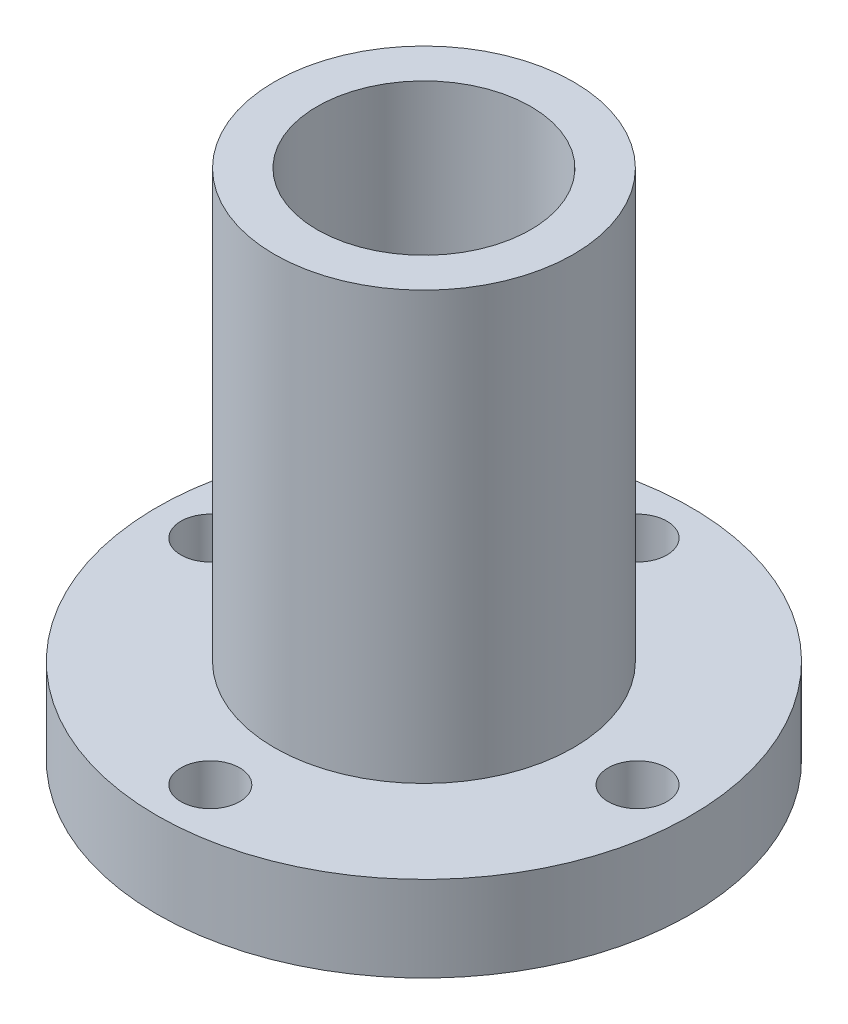
ISO-10303-21;
HEADER;
FILE_DESCRIPTION(('STEP AP214'),'2;1');
FILE_NAME('part.step','',(''),(''),'','','');
FILE_SCHEMA(('AUTOMOTIVE_DESIGN { 1 0 10303 214 1 1 1 1 }'));
ENDSEC;
DATA;
#1=APPLICATION_CONTEXT('core data for automotive mechanical design processes');
#2=APPLICATION_PROTOCOL_DEFINITION('international standard','automotive_design',2000,#1);
#3=PRODUCT_CONTEXT('',#1,'mechanical');
#4=PRODUCT('Part','Part','',(#3));
#5=PRODUCT_RELATED_PRODUCT_CATEGORY('part','',(#4));
#6=PRODUCT_DEFINITION_FORMATION('','',#4);
#7=PRODUCT_DEFINITION_CONTEXT('part definition',#1,'design');
#8=PRODUCT_DEFINITION('design','',#6,#7);
#9=PRODUCT_DEFINITION_SHAPE('','',#8);
#10=(LENGTH_UNIT() NAMED_UNIT(*) SI_UNIT(.MILLI.,.METRE.));
#11=(NAMED_UNIT(*) PLANE_ANGLE_UNIT() SI_UNIT($,.RADIAN.));
#12=(NAMED_UNIT(*) SI_UNIT($,.STERADIAN.) SOLID_ANGLE_UNIT());
#13=UNCERTAINTY_MEASURE_WITH_UNIT(LENGTH_MEASURE(1.E-05),#10,'distance_accuracy_value','');
#14=(GEOMETRIC_REPRESENTATION_CONTEXT(3) GLOBAL_UNCERTAINTY_ASSIGNED_CONTEXT((#13)) GLOBAL_UNIT_ASSIGNED_CONTEXT((#10,
#11,#12)) REPRESENTATION_CONTEXT('',''));
#15=CARTESIAN_POINT('',(0.,0.,0.));
#16=DIRECTION('',(0.,0.,1.));
#17=DIRECTION('',(1.,0.,0.));
#18=AXIS2_PLACEMENT_3D('',#15,#16,#17);
#19=CARTESIAN_POINT('',(0.,8.,0.));
#20=DIRECTION('',(0.,-1.,0.));
#21=DIRECTION('',(0.,0.,-1.));
#22=AXIS2_PLACEMENT_3D('',#19,#20,#21);
#23=CYLINDRICAL_SURFACE('',#22,25.);
#24=CARTESIAN_POINT('',(0.,8.,0.));
#25=DIRECTION('',(0.,1.,0.));
#26=DIRECTION('',(0.,0.,1.));
#27=AXIS2_PLACEMENT_3D('',#24,#25,#26);
#28=CIRCLE('',#27,25.);
#29=CARTESIAN_POINT('',(0.,8.,25.));
#30=VERTEX_POINT('',#29);
#31=EDGE_CURVE('E42',#30,#30,#28,.T.);
#32=ORIENTED_EDGE('',*,*,#31,.F.);
#33=EDGE_LOOP('',(#32));
#34=FACE_BOUND('',#33,.T.);
#35=CARTESIAN_POINT('',(0.,0.,0.));
#36=DIRECTION('',(0.,1.,0.));
#37=DIRECTION('',(0.,0.,1.));
#38=AXIS2_PLACEMENT_3D('',#35,#36,#37);
#39=CIRCLE('',#38,25.);
#40=CARTESIAN_POINT('',(0.,0.,25.));
#41=VERTEX_POINT('',#40);
#42=EDGE_CURVE('E47',#41,#41,#39,.T.);
#43=ORIENTED_EDGE('',*,*,#42,.T.);
#44=EDGE_LOOP('',(#43));
#45=FACE_BOUND('',#44,.T.);
#46=ADVANCED_FACE('F35',(#34,#45),#23,.T.);
#47=CARTESIAN_POINT('',(0.,8.,0.));
#48=DIRECTION('',(0.,1.,0.));
#49=DIRECTION('',(0.,0.,1.));
#50=AXIS2_PLACEMENT_3D('',#47,#48,#49);
#51=PLANE('',#50);
#52=CARTESIAN_POINT('',(0.,8.,-20.));
#53=DIRECTION('',(0.,1.,0.));
#54=DIRECTION('',(0.,0.,1.));
#55=AXIS2_PLACEMENT_3D('',#52,#53,#54);
#56=CIRCLE('',#55,2.75);
#57=CARTESIAN_POINT('',(0.,8.,-17.25));
#58=VERTEX_POINT('',#57);
#59=EDGE_CURVE('E63',#58,#58,#56,.T.);
#60=ORIENTED_EDGE('',*,*,#59,.F.);
#61=EDGE_LOOP('',(#60));
#62=FACE_BOUND('',#61,.T.);
#63=CARTESIAN_POINT('',(20.,8.,0.));
#64=DIRECTION('',(0.,1.,0.));
#65=DIRECTION('',(0.,0.,1.));
#66=AXIS2_PLACEMENT_3D('',#63,#64,#65);
#67=CIRCLE('',#66,2.75);
#68=CARTESIAN_POINT('',(20.,8.,2.75));
#69=VERTEX_POINT('',#68);
#70=EDGE_CURVE('E67',#69,#69,#67,.T.);
#71=ORIENTED_EDGE('',*,*,#70,.F.);
#72=EDGE_LOOP('',(#71));
#73=FACE_BOUND('',#72,.T.);
#74=CARTESIAN_POINT('',(0.,8.,20.));
#75=DIRECTION('',(0.,1.,0.));
#76=DIRECTION('',(0.,0.,1.));
#77=AXIS2_PLACEMENT_3D('',#74,#75,#76);
#78=CIRCLE('',#77,2.75);
#79=CARTESIAN_POINT('',(0.,8.,22.75));
#80=VERTEX_POINT('',#79);
#81=EDGE_CURVE('E72',#80,#80,#78,.T.);
#82=ORIENTED_EDGE('',*,*,#81,.F.);
#83=EDGE_LOOP('',(#82));
#84=FACE_BOUND('',#83,.T.);
#85=CARTESIAN_POINT('',(-20.,8.,0.));
#86=DIRECTION('',(0.,1.,0.));
#87=DIRECTION('',(0.,0.,1.));
#88=AXIS2_PLACEMENT_3D('',#85,#86,#87);
#89=CIRCLE('',#88,2.75);
#90=CARTESIAN_POINT('',(-20.,8.,2.75));
#91=VERTEX_POINT('',#90);
#92=EDGE_CURVE('E75',#91,#91,#89,.T.);
#93=ORIENTED_EDGE('',*,*,#92,.F.);
#94=EDGE_LOOP('',(#93));
#95=FACE_BOUND('',#94,.T.);
#96=CARTESIAN_POINT('',(0.,8.,0.));
#97=DIRECTION('',(0.,1.,0.));
#98=DIRECTION('',(0.,0.,1.));
#99=AXIS2_PLACEMENT_3D('',#96,#97,#98);
#100=CIRCLE('',#99,14.);
#101=CARTESIAN_POINT('',(0.,8.,14.));
#102=VERTEX_POINT('',#101);
#103=EDGE_CURVE('E10',#102,#102,#100,.T.);
#104=ORIENTED_EDGE('',*,*,#103,.F.);
#105=EDGE_LOOP('',(#104));
#106=FACE_BOUND('',#105,.T.);
#107=ORIENTED_EDGE('',*,*,#31,.T.);
#108=EDGE_LOOP('',(#107));
#109=FACE_BOUND('',#108,.T.);
#110=ADVANCED_FACE('F106',(#62,#73,#84,#95,#106,#109),#51,.T.);
#111=CARTESIAN_POINT('',(0.,0.,0.));
#112=DIRECTION('',(0.,1.,0.));
#113=DIRECTION('',(0.,0.,1.));
#114=AXIS2_PLACEMENT_3D('',#111,#112,#113);
#115=PLANE('',#114);
#116=CARTESIAN_POINT('',(0.,0.,-20.));
#117=DIRECTION('',(0.,1.,0.));
#118=DIRECTION('',(0.,0.,1.));
#119=AXIS2_PLACEMENT_3D('',#116,#117,#118);
#120=CIRCLE('',#119,2.75);
#121=CARTESIAN_POINT('',(0.,0.,-17.25));
#122=VERTEX_POINT('',#121);
#123=EDGE_CURVE('E78',#122,#122,#120,.T.);
#124=ORIENTED_EDGE('',*,*,#123,.T.);
#125=EDGE_LOOP('',(#124));
#126=FACE_BOUND('',#125,.T.);
#127=CARTESIAN_POINT('',(20.,0.,0.));
#128=DIRECTION('',(0.,1.,0.));
#129=DIRECTION('',(0.,0.,1.));
#130=AXIS2_PLACEMENT_3D('',#127,#128,#129);
#131=CIRCLE('',#130,2.75);
#132=CARTESIAN_POINT('',(20.,0.,2.75));
#133=VERTEX_POINT('',#132);
#134=EDGE_CURVE('E85',#133,#133,#131,.T.);
#135=ORIENTED_EDGE('',*,*,#134,.T.);
#136=EDGE_LOOP('',(#135));
#137=FACE_BOUND('',#136,.T.);
#138=CARTESIAN_POINT('',(0.,0.,20.));
#139=DIRECTION('',(0.,1.,0.));
#140=DIRECTION('',(0.,0.,1.));
#141=AXIS2_PLACEMENT_3D('',#138,#139,#140);
#142=CIRCLE('',#141,2.75);
#143=CARTESIAN_POINT('',(0.,0.,22.75));
#144=VERTEX_POINT('',#143);
#145=EDGE_CURVE('E82',#144,#144,#142,.T.);
#146=ORIENTED_EDGE('',*,*,#145,.T.);
#147=EDGE_LOOP('',(#146));
#148=FACE_BOUND('',#147,.T.);
#149=CARTESIAN_POINT('',(-20.,0.,0.));
#150=DIRECTION('',(0.,1.,0.));
#151=DIRECTION('',(0.,0.,1.));
#152=AXIS2_PLACEMENT_3D('',#149,#150,#151);
#153=CIRCLE('',#152,2.75);
#154=CARTESIAN_POINT('',(-20.,0.,2.75));
#155=VERTEX_POINT('',#154);
#156=EDGE_CURVE('E79',#155,#155,#153,.T.);
#157=ORIENTED_EDGE('',*,*,#156,.T.);
#158=EDGE_LOOP('',(#157));
#159=FACE_BOUND('',#158,.T.);
#160=CARTESIAN_POINT('',(0.,0.,0.));
#161=DIRECTION('',(0.,1.,0.));
#162=DIRECTION('',(0.,0.,1.));
#163=AXIS2_PLACEMENT_3D('',#160,#161,#162);
#164=CIRCLE('',#163,10.);
#165=CARTESIAN_POINT('',(0.,0.,10.));
#166=VERTEX_POINT('',#165);
#167=EDGE_CURVE('E59',#166,#166,#164,.T.);
#168=ORIENTED_EDGE('',*,*,#167,.T.);
#169=EDGE_LOOP('',(#168));
#170=FACE_BOUND('',#169,.T.);
#171=ORIENTED_EDGE('',*,*,#42,.F.);
#172=EDGE_LOOP('',(#171));
#173=FACE_BOUND('',#172,.T.);
#174=ADVANCED_FACE('F91',(#126,#137,#148,#159,#170,#173),#115,.F.);
#175=CARTESIAN_POINT('',(0.,48.,0.));
#176=DIRECTION('',(0.,-1.,0.));
#177=DIRECTION('',(0.,0.,-1.));
#178=AXIS2_PLACEMENT_3D('',#175,#176,#177);
#179=CYLINDRICAL_SURFACE('',#178,14.);
#180=CARTESIAN_POINT('',(0.,48.,0.));
#181=DIRECTION('',(0.,1.,0.));
#182=DIRECTION('',(0.,0.,1.));
#183=AXIS2_PLACEMENT_3D('',#180,#181,#182);
#184=CIRCLE('',#183,14.);
#185=CARTESIAN_POINT('',(0.,48.,14.));
#186=VERTEX_POINT('',#185);
#187=EDGE_CURVE('E50',#186,#186,#184,.T.);
#188=ORIENTED_EDGE('',*,*,#187,.F.);
#189=EDGE_LOOP('',(#188));
#190=FACE_BOUND('',#189,.T.);
#191=ORIENTED_EDGE('',*,*,#103,.T.);
#192=EDGE_LOOP('',(#191));
#193=FACE_BOUND('',#192,.T.);
#194=ADVANCED_FACE('F118',(#190,#193),#179,.T.);
#195=CARTESIAN_POINT('',(0.,48.,0.));
#196=DIRECTION('',(0.,1.,0.));
#197=DIRECTION('',(0.,0.,1.));
#198=AXIS2_PLACEMENT_3D('',#195,#196,#197);
#199=PLANE('',#198);
#200=CARTESIAN_POINT('',(0.,48.,0.));
#201=DIRECTION('',(0.,1.,0.));
#202=DIRECTION('',(0.,0.,1.));
#203=AXIS2_PLACEMENT_3D('',#200,#201,#202);
#204=CIRCLE('',#203,10.);
#205=CARTESIAN_POINT('',(0.,48.,10.));
#206=VERTEX_POINT('',#205);
#207=EDGE_CURVE('E38',#206,#206,#204,.T.);
#208=ORIENTED_EDGE('',*,*,#207,.F.);
#209=EDGE_LOOP('',(#208));
#210=FACE_BOUND('',#209,.T.);
#211=ORIENTED_EDGE('',*,*,#187,.T.);
#212=EDGE_LOOP('',(#211));
#213=FACE_BOUND('',#212,.T.);
#214=ADVANCED_FACE('F124',(#210,#213),#199,.T.);
#215=CARTESIAN_POINT('',(0.,0.,0.));
#216=DIRECTION('',(0.,1.,0.));
#217=DIRECTION('',(0.,0.,1.));
#218=AXIS2_PLACEMENT_3D('',#215,#216,#217);
#219=CYLINDRICAL_SURFACE('',#218,10.);
#220=ORIENTED_EDGE('',*,*,#207,.T.);
#221=EDGE_LOOP('',(#220));
#222=FACE_BOUND('',#221,.T.);
#223=ORIENTED_EDGE('',*,*,#167,.F.);
#224=EDGE_LOOP('',(#223));
#225=FACE_BOUND('',#224,.T.);
#226=ADVANCED_FACE('F128',(#222,#225),#219,.F.);
#227=CARTESIAN_POINT('',(-20.,0.,0.));
#228=DIRECTION('',(0.,1.,0.));
#229=DIRECTION('',(0.,0.,1.));
#230=AXIS2_PLACEMENT_3D('',#227,#228,#229);
#231=CYLINDRICAL_SURFACE('',#230,2.75);
#232=ORIENTED_EDGE('',*,*,#92,.T.);
#233=EDGE_LOOP('',(#232));
#234=FACE_BOUND('',#233,.T.);
#235=ORIENTED_EDGE('',*,*,#156,.F.);
#236=EDGE_LOOP('',(#235));
#237=FACE_BOUND('',#236,.T.);
#238=ADVANCED_FACE('F132',(#234,#237),#231,.F.);
#239=CARTESIAN_POINT('',(0.,0.,20.));
#240=DIRECTION('',(0.,1.,0.));
#241=DIRECTION('',(0.,0.,1.));
#242=AXIS2_PLACEMENT_3D('',#239,#240,#241);
#243=CYLINDRICAL_SURFACE('',#242,2.75);
#244=ORIENTED_EDGE('',*,*,#81,.T.);
#245=EDGE_LOOP('',(#244));
#246=FACE_BOUND('',#245,.T.);
#247=ORIENTED_EDGE('',*,*,#145,.F.);
#248=EDGE_LOOP('',(#247));
#249=FACE_BOUND('',#248,.T.);
#250=ADVANCED_FACE('F102',(#246,#249),#243,.F.);
#251=CARTESIAN_POINT('',(20.,0.,0.));
#252=DIRECTION('',(0.,1.,0.));
#253=DIRECTION('',(0.,0.,1.));
#254=AXIS2_PLACEMENT_3D('',#251,#252,#253);
#255=CYLINDRICAL_SURFACE('',#254,2.75);
#256=ORIENTED_EDGE('',*,*,#70,.T.);
#257=EDGE_LOOP('',(#256));
#258=FACE_BOUND('',#257,.T.);
#259=ORIENTED_EDGE('',*,*,#134,.F.);
#260=EDGE_LOOP('',(#259));
#261=FACE_BOUND('',#260,.T.);
#262=ADVANCED_FACE('F96',(#258,#261),#255,.F.);
#263=CARTESIAN_POINT('',(0.,0.,-20.));
#264=DIRECTION('',(0.,1.,0.));
#265=DIRECTION('',(0.,0.,1.));
#266=AXIS2_PLACEMENT_3D('',#263,#264,#265);
#267=CYLINDRICAL_SURFACE('',#266,2.75);
#268=ORIENTED_EDGE('',*,*,#59,.T.);
#269=EDGE_LOOP('',(#268));
#270=FACE_BOUND('',#269,.T.);
#271=ORIENTED_EDGE('',*,*,#123,.F.);
#272=EDGE_LOOP('',(#271));
#273=FACE_BOUND('',#272,.T.);
#274=ADVANCED_FACE('F94',(#270,#273),#267,.F.);
#275=CLOSED_SHELL('',(#46,#110,#174,#194,#214,#226,#238,#250,#262,#274));
#276=MANIFOLD_SOLID_BREP('B2',#275);
#277=ADVANCED_BREP_SHAPE_REPRESENTATION('',(#18,#276),#14);
#278=SHAPE_DEFINITION_REPRESENTATION(#9,#277);
ENDSEC;
END-ISO-10303-21;
